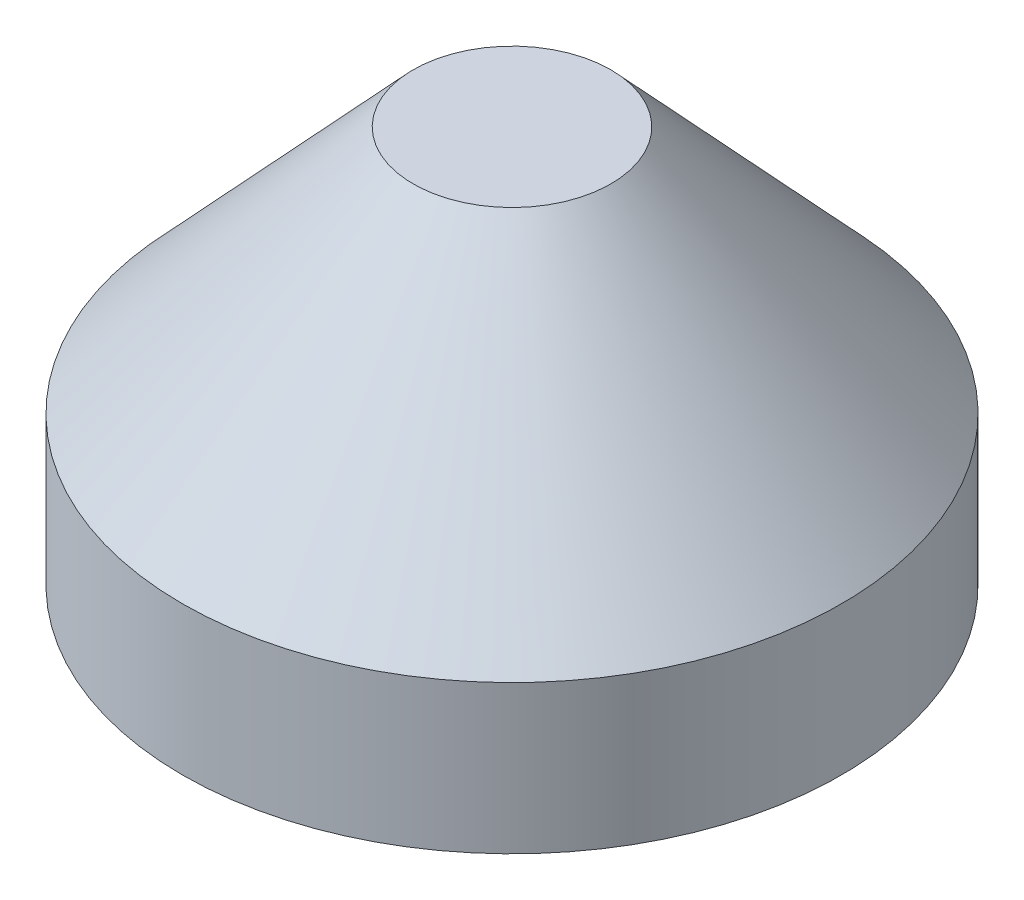
ISO-10303-21;
HEADER;
FILE_DESCRIPTION(('STEP AP214'),'2;1');
FILE_NAME('part.step','',(''),(''),'','','');
FILE_SCHEMA(('AUTOMOTIVE_DESIGN { 1 0 10303 214 1 1 1 1 }'));
ENDSEC;
DATA;
#1=APPLICATION_CONTEXT('core data for automotive mechanical design processes');
#2=APPLICATION_PROTOCOL_DEFINITION('international standard','automotive_design',2000,#1);
#3=PRODUCT_CONTEXT('',#1,'mechanical');
#4=PRODUCT('Part','Part','',(#3));
#5=PRODUCT_RELATED_PRODUCT_CATEGORY('part','',(#4));
#6=PRODUCT_DEFINITION_FORMATION('','',#4);
#7=PRODUCT_DEFINITION_CONTEXT('part definition',#1,'design');
#8=PRODUCT_DEFINITION('design','',#6,#7);
#9=PRODUCT_DEFINITION_SHAPE('','',#8);
#10=(LENGTH_UNIT() NAMED_UNIT(*) SI_UNIT(.MILLI.,.METRE.));
#11=(NAMED_UNIT(*) PLANE_ANGLE_UNIT() SI_UNIT($,.RADIAN.));
#12=(NAMED_UNIT(*) SI_UNIT($,.STERADIAN.) SOLID_ANGLE_UNIT());
#13=UNCERTAINTY_MEASURE_WITH_UNIT(LENGTH_MEASURE(1.E-05),#10,'distance_accuracy_value','');
#14=(GEOMETRIC_REPRESENTATION_CONTEXT(3) GLOBAL_UNCERTAINTY_ASSIGNED_CONTEXT((#13)) GLOBAL_UNIT_ASSIGNED_CONTEXT((#10,
#11,#12)) REPRESENTATION_CONTEXT('',''));
#15=CARTESIAN_POINT('',(0.,0.,0.));
#16=DIRECTION('',(0.,0.,1.));
#17=DIRECTION('',(1.,0.,0.));
#18=AXIS2_PLACEMENT_3D('',#15,#16,#17);
#19=CARTESIAN_POINT('',(0.,0.,0.));
#20=DIRECTION('',(0.,-1.,0.));
#21=DIRECTION('',(0.,0.,-1.));
#22=AXIS2_PLACEMENT_3D('',#19,#20,#21);
#23=CYLINDRICAL_SURFACE('',#22,6.);
#24=CARTESIAN_POINT('',(0.,0.,0.));
#25=DIRECTION('',(0.,-1.,0.));
#26=DIRECTION('',(0.,0.,-1.));
#27=AXIS2_PLACEMENT_3D('',#24,#25,#26);
#28=CIRCLE('',#27,6.);
#29=CARTESIAN_POINT('',(0.,0.,-6.));
#30=VERTEX_POINT('',#29);
#31=EDGE_CURVE('E10',#30,#30,#28,.T.);
#32=ORIENTED_EDGE('',*,*,#31,.F.);
#33=EDGE_LOOP('',(#32));
#34=FACE_BOUND('',#33,.T.);
#35=CARTESIAN_POINT('',(0.,2.7,0.));
#36=DIRECTION('',(0.,-1.,0.));
#37=DIRECTION('',(0.,0.,-1.));
#38=AXIS2_PLACEMENT_3D('',#35,#36,#37);
#39=CIRCLE('',#38,6.);
#40=CARTESIAN_POINT('',(0.,2.7,-6.));
#41=VERTEX_POINT('',#40);
#42=EDGE_CURVE('E40',#41,#41,#39,.T.);
#43=ORIENTED_EDGE('',*,*,#42,.T.);
#44=EDGE_LOOP('',(#43));
#45=FACE_BOUND('',#44,.T.);
#46=ADVANCED_FACE('F30',(#34,#45),#23,.T.);
#47=CARTESIAN_POINT('',(0.,0.,0.));
#48=DIRECTION('',(0.,1.,0.));
#49=DIRECTION('',(0.,0.,1.));
#50=AXIS2_PLACEMENT_3D('',#47,#48,#49);
#51=PLANE('',#50);
#52=ORIENTED_EDGE('',*,*,#31,.T.);
#53=EDGE_LOOP('',(#52));
#54=FACE_BOUND('',#53,.T.);
#55=ADVANCED_FACE('F55',(#54),#51,.F.);
#56=CARTESIAN_POINT('',(0.,7.22,0.));
#57=DIRECTION('',(0.,-1.,0.));
#58=DIRECTION('',(0.,0.,-1.));
#59=AXIS2_PLACEMENT_3D('',#56,#57,#58);
#60=PLANE('',#59);
#61=CARTESIAN_POINT('',(0.,7.22,0.));
#62=DIRECTION('',(0.,-1.,0.));
#63=DIRECTION('',(0.,0.,-1.));
#64=AXIS2_PLACEMENT_3D('',#61,#62,#63);
#65=CIRCLE('',#64,1.8);
#66=CARTESIAN_POINT('',(0.,7.22,-1.8));
#67=VERTEX_POINT('',#66);
#68=EDGE_CURVE('E36',#67,#67,#65,.T.);
#69=ORIENTED_EDGE('',*,*,#68,.F.);
#70=EDGE_LOOP('',(#69));
#71=FACE_BOUND('',#70,.T.);
#72=ADVANCED_FACE('F50',(#71),#60,.F.);
#73=CARTESIAN_POINT('',(0.,7.22,0.));
#74=DIRECTION('',(0.,-1.,0.));
#75=DIRECTION('',(0.,0.,-1.));
#76=AXIS2_PLACEMENT_3D('',#73,#74,#75);
#77=CONICAL_SURFACE('',#76,1.8,0.748717375640797);
#78=CARTESIAN_POINT('',(0.,2.7,-6.));
#79=CARTESIAN_POINT('',(0.,2.74708333333333,-5.95625));
#80=CARTESIAN_POINT('',(0.,2.79416666666667,-5.9125));
#81=CARTESIAN_POINT('',(0.,2.88833333333333,-5.825));
#82=CARTESIAN_POINT('',(0.,2.93541666666667,-5.78125));
#83=CARTESIAN_POINT('',(0.,3.02958333333333,-5.69375));
#84=CARTESIAN_POINT('',(0.,3.07666666666667,-5.65));
#85=CARTESIAN_POINT('',(0.,3.17083333333333,-5.5625));
#86=CARTESIAN_POINT('',(0.,3.21791666666667,-5.51875));
#87=CARTESIAN_POINT('',(0.,3.31208333333333,-5.43125));
#88=CARTESIAN_POINT('',(0.,3.35916666666667,-5.3875));
#89=CARTESIAN_POINT('',(0.,3.45333333333333,-5.3));
#90=CARTESIAN_POINT('',(0.,3.50041666666667,-5.25625));
#91=CARTESIAN_POINT('',(0.,3.59458333333333,-5.16875));
#92=CARTESIAN_POINT('',(0.,3.64166666666667,-5.125));
#93=CARTESIAN_POINT('',(0.,3.73583333333333,-5.0375));
#94=CARTESIAN_POINT('',(0.,3.78291666666667,-4.99375));
#95=CARTESIAN_POINT('',(0.,3.87708333333333,-4.90625));
#96=CARTESIAN_POINT('',(0.,3.92416666666667,-4.8625));
#97=CARTESIAN_POINT('',(0.,4.01833333333333,-4.775));
#98=CARTESIAN_POINT('',(0.,4.06541666666667,-4.73125));
#99=CARTESIAN_POINT('',(0.,4.15958333333333,-4.64375));
#100=CARTESIAN_POINT('',(0.,4.20666666666667,-4.6));
#101=CARTESIAN_POINT('',(0.,4.30083333333333,-4.5125));
#102=CARTESIAN_POINT('',(0.,4.34791666666667,-4.46875));
#103=CARTESIAN_POINT('',(0.,4.44208333333333,-4.38125));
#104=CARTESIAN_POINT('',(0.,4.48916666666667,-4.3375));
#105=CARTESIAN_POINT('',(0.,4.58333333333333,-4.25));
#106=CARTESIAN_POINT('',(0.,4.63041666666667,-4.20625));
#107=CARTESIAN_POINT('',(0.,4.72458333333333,-4.11875));
#108=CARTESIAN_POINT('',(0.,4.77166666666667,-4.075));
#109=CARTESIAN_POINT('',(0.,4.86583333333333,-3.9875));
#110=CARTESIAN_POINT('',(0.,4.91291666666667,-3.94375));
#111=CARTESIAN_POINT('',(0.,5.00708333333333,-3.85625));
#112=CARTESIAN_POINT('',(0.,5.05416666666667,-3.8125));
#113=CARTESIAN_POINT('',(0.,5.14833333333333,-3.725));
#114=CARTESIAN_POINT('',(0.,5.19541666666667,-3.68125));
#115=CARTESIAN_POINT('',(0.,5.28958333333333,-3.59375));
#116=CARTESIAN_POINT('',(0.,5.33666666666667,-3.55));
#117=CARTESIAN_POINT('',(0.,5.43083333333333,-3.4625));
#118=CARTESIAN_POINT('',(0.,5.47791666666667,-3.41875));
#119=CARTESIAN_POINT('',(0.,5.57208333333333,-3.33125));
#120=CARTESIAN_POINT('',(0.,5.61916666666667,-3.2875));
#121=CARTESIAN_POINT('',(0.,5.71333333333333,-3.2));
#122=CARTESIAN_POINT('',(0.,5.76041666666667,-3.15625));
#123=CARTESIAN_POINT('',(0.,5.85458333333333,-3.06875));
#124=CARTESIAN_POINT('',(0.,5.90166666666667,-3.025));
#125=CARTESIAN_POINT('',(0.,5.99583333333333,-2.9375));
#126=CARTESIAN_POINT('',(0.,6.04291666666667,-2.89375));
#127=CARTESIAN_POINT('',(0.,6.13708333333333,-2.80625));
#128=CARTESIAN_POINT('',(0.,6.18416666666667,-2.7625));
#129=CARTESIAN_POINT('',(0.,6.27833333333333,-2.675));
#130=CARTESIAN_POINT('',(0.,6.32541666666667,-2.63125));
#131=CARTESIAN_POINT('',(0.,6.41958333333333,-2.54375));
#132=CARTESIAN_POINT('',(0.,6.46666666666667,-2.5));
#133=CARTESIAN_POINT('',(0.,6.56083333333333,-2.4125));
#134=CARTESIAN_POINT('',(0.,6.60791666666667,-2.36875));
#135=CARTESIAN_POINT('',(0.,6.70208333333333,-2.28125));
#136=CARTESIAN_POINT('',(0.,6.74916666666667,-2.2375));
#137=CARTESIAN_POINT('',(0.,6.84333333333333,-2.15));
#138=CARTESIAN_POINT('',(0.,6.89041666666667,-2.10625));
#139=CARTESIAN_POINT('',(0.,6.98458333333333,-2.01875));
#140=CARTESIAN_POINT('',(0.,7.03166666666667,-1.975));
#141=CARTESIAN_POINT('',(0.,7.12583333333333,-1.8875));
#142=CARTESIAN_POINT('',(0.,7.17291666666667,-1.84375));
#143=CARTESIAN_POINT('',(0.,7.22,-1.8));
#144=B_SPLINE_CURVE_WITH_KNOTS('',3,(#78,#79,#80,#81,#82,#83,#84,#85,#86,#87,#88,#89,#90,#91,
#92,#93,#94,#95,#96,#97,#98,#99,#100,#101,#102,#103,#104,#105,#106,#107,#108,#109,#110,#111,
#112,#113,#114,#115,#116,#117,#118,#119,#120,#121,#122,#123,#124,#125,#126,#127,#128,#129,#130,
#131,#132,#133,#134,#135,#136,#137,#138,#139,#140,#141,#142,#143),.UNSPECIFIED.,.F.,.F.,(4,2,2,
2,2,2,2,2,2,2,2,2,2,2,2,2,2,2,2,2,2,2,2,2,2,2,2,2,2,2,2,2,4),(0.,0.192816298584948,
0.385632597169897,0.578448895754845,0.771265194339793,0.964081492924742,1.15689779150969,
1.34971409009464,1.54253038867959,1.73534668726454,1.92816298584948,2.12097928443443,
2.31379558301938,2.50661188160433,2.69942818018928,2.89224447877423,3.08506077735918,
3.27787707594412,3.47069337452907,3.66350967311402,3.85632597169897,4.04914227028392,
4.24195856886887,4.43477486745382,4.62759116603876,4.82040746462371,5.01322376320866,
5.20604006179361,5.39885636037856,5.59167265896351,5.78448895754846,5.9773052561334,
6.17012155471835),.UNSPECIFIED.);
#145=EDGE_CURVE('BSEAM48',#41,#67,#144,.T.);
#146=ORIENTED_EDGE('',*,*,#42,.F.);
#147=ORIENTED_EDGE('',*,*,#68,.T.);
#148=ORIENTED_EDGE('',*,*,#145,.T.);
#149=ORIENTED_EDGE('',*,*,#145,.F.);
#150=EDGE_LOOP('',(#146,#148,#147,#149));
#151=FACE_BOUND('',#150,.T.);
#152=ADVANCED_FACE('F48',(#151),#77,.T.);
#153=CLOSED_SHELL('',(#46,#55,#72,#152));
#154=MANIFOLD_SOLID_BREP('B2',#153);
#155=ADVANCED_BREP_SHAPE_REPRESENTATION('',(#18,#154),#14);
#156=SHAPE_DEFINITION_REPRESENTATION(#9,#155);
ENDSEC;
END-ISO-10303-21;
